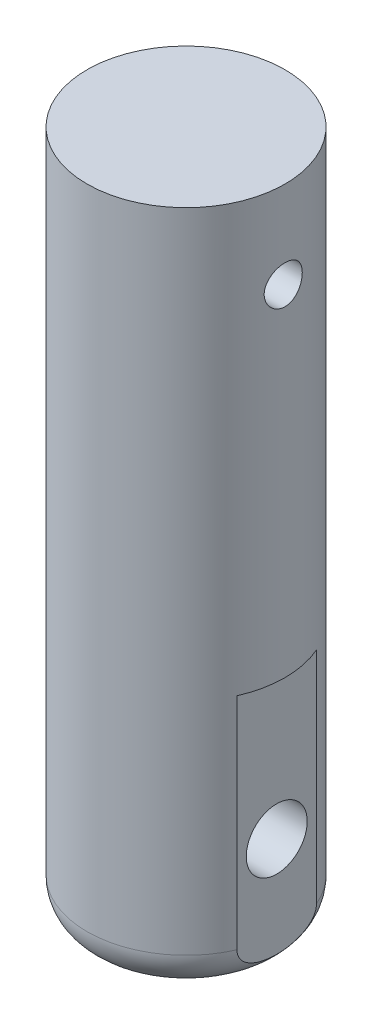
ISO-10303-21;
HEADER;
FILE_DESCRIPTION(('STEP AP214'),'2;1');
FILE_NAME('part.step','',(''),(''),'','','');
FILE_SCHEMA(('AUTOMOTIVE_DESIGN { 1 0 10303 214 1 1 1 1 }'));
ENDSEC;
DATA;
#1=APPLICATION_CONTEXT('core data for automotive mechanical design processes');
#2=APPLICATION_PROTOCOL_DEFINITION('international standard','automotive_design',2000,#1);
#3=PRODUCT_CONTEXT('',#1,'mechanical');
#4=PRODUCT('Part','Part','',(#3));
#5=PRODUCT_RELATED_PRODUCT_CATEGORY('part','',(#4));
#6=PRODUCT_DEFINITION_FORMATION('','',#4);
#7=PRODUCT_DEFINITION_CONTEXT('part definition',#1,'design');
#8=PRODUCT_DEFINITION('design','',#6,#7);
#9=PRODUCT_DEFINITION_SHAPE('','',#8);
#10=(LENGTH_UNIT() NAMED_UNIT(*) SI_UNIT(.MILLI.,.METRE.));
#11=(NAMED_UNIT(*) PLANE_ANGLE_UNIT() SI_UNIT($,.RADIAN.));
#12=(NAMED_UNIT(*) SI_UNIT($,.STERADIAN.) SOLID_ANGLE_UNIT());
#13=UNCERTAINTY_MEASURE_WITH_UNIT(LENGTH_MEASURE(1.E-05),#10,'distance_accuracy_value','');
#14=(GEOMETRIC_REPRESENTATION_CONTEXT(3) GLOBAL_UNCERTAINTY_ASSIGNED_CONTEXT((#13)) GLOBAL_UNIT_ASSIGNED_CONTEXT((#10,
#11,#12)) REPRESENTATION_CONTEXT('',''));
#15=CARTESIAN_POINT('',(0.,0.,0.));
#16=DIRECTION('',(0.,0.,1.));
#17=DIRECTION('',(1.,0.,0.));
#18=AXIS2_PLACEMENT_3D('',#15,#16,#17);
#19=CARTESIAN_POINT('',(0.959256221842165,90.,-2.8421709430404E-11));
#20=DIRECTION('',(0.,-1.,0.));
#21=DIRECTION('',(0.,0.,-1.));
#22=AXIS2_PLACEMENT_3D('',#19,#20,#21);
#23=CYLINDRICAL_SURFACE('',#22,13.);
#24=CARTESIAN_POINT('',(-11.7980944172989,78.559645060139,-2.5000009340297));
#25=CARTESIAN_POINT('',(-11.7980971397234,78.6986709186465,-2.49999567174065));
#26=CARTESIAN_POINT('',(-11.800391702647,78.8377642878141,-2.48836465883411));
#27=CARTESIAN_POINT('',(-11.8093098315006,79.112024114006,-2.44218207228531));
#28=CARTESIAN_POINT('',(-11.8159369909497,79.247187213923,-2.4076114718561));
#29=CARTESIAN_POINT('',(-11.8327426152477,79.5095786960919,-2.31665468417989));
#30=CARTESIAN_POINT('',(-11.8429176866454,79.6368145239185,-2.26028933723979));
#31=CARTESIAN_POINT('',(-11.8656686376155,79.8800175977177,-2.12739897712118));
#32=CARTESIAN_POINT('',(-11.8782443500382,79.9959856273865,-2.05087536736297));
#33=CARTESIAN_POINT('',(-11.9045634266255,80.2148862582884,-1.87877340478143));
#34=CARTESIAN_POINT('',(-11.9183187571341,80.3176499954425,-1.78298206659836));
#35=CARTESIAN_POINT('',(-11.9453416423316,80.5057525765596,-1.57552407348461));
#36=CARTESIAN_POINT('',(-11.9586091641418,80.5910902477511,-1.4638563509329));
#37=CARTESIAN_POINT('',(-11.9832900646934,80.7425684592079,-1.22670282510391));
#38=CARTESIAN_POINT('',(-11.9946876956765,80.808549309162,-1.10111324278706));
#39=CARTESIAN_POINT('',(-12.0142104859742,80.9184114786799,-0.840375431836772));
#40=CARTESIAN_POINT('',(-12.0223359283465,80.9622947098609,-0.705228031183496));
#41=CARTESIAN_POINT('',(-12.0343142975435,81.026192460814,-0.43096179585055));
#42=CARTESIAN_POINT('',(-12.0382181729573,81.0464918335644,-0.291911587409392));
#43=CARTESIAN_POINT('',(-12.0414892890508,81.0635336433959,-0.0123280169445277));
#44=CARTESIAN_POINT('',(-12.0408569352359,81.0602781861046,0.128205211386721));
#45=CARTESIAN_POINT('',(-12.0351665307891,81.0305202987771,0.404810638875102));
#46=CARTESIAN_POINT('',(-12.0301668824495,81.0043246285081,0.540917215509431));
#47=CARTESIAN_POINT('',(-12.0163692903157,80.9299156074697,0.806766110944418));
#48=CARTESIAN_POINT('',(-12.0075712028652,80.8817014239592,0.936508188833932));
#49=CARTESIAN_POINT('',(-11.987068189863,80.7643347796258,1.18682943011321));
#50=CARTESIAN_POINT('',(-11.9753464416461,80.6950606169463,1.30735009768936));
#51=CARTESIAN_POINT('',(-11.950290868334,80.5376302693267,1.53517053007103));
#52=CARTESIAN_POINT('',(-11.9369568711973,80.449472068515,1.64246888146599));
#53=CARTESIAN_POINT('',(-11.9098984475364,80.2550885563889,1.84261753033746));
#54=CARTESIAN_POINT('',(-11.8961711923935,80.1485948325347,1.93520695029387));
#55=CARTESIAN_POINT('',(-11.870078331895,79.921454894863,2.10125222332554));
#56=CARTESIAN_POINT('',(-11.8577127485699,79.8008084521354,2.17470776686218));
#57=CARTESIAN_POINT('',(-11.835738633768,79.548431056198,2.30048039273782));
#58=CARTESIAN_POINT('',(-11.826135268998,79.4166799190848,2.35275793541656));
#59=CARTESIAN_POINT('',(-11.8108507241306,79.1460375213901,2.43436016291581));
#60=CARTESIAN_POINT('',(-11.8051690746174,79.0071471174932,2.46368759484182));
#61=CARTESIAN_POINT('',(-11.7984645750477,78.7285257516579,2.49817281715572));
#62=CARTESIAN_POINT('',(-11.7973693475591,78.5888429614396,2.50370613571886));
#63=CARTESIAN_POINT('',(-11.7997677911244,78.3105497087784,2.49145416692711));
#64=CARTESIAN_POINT('',(-11.8032612227563,78.1719391907671,2.47367009620102));
#65=CARTESIAN_POINT('',(-11.8143758073665,77.9009701246894,2.41561107418377));
#66=CARTESIAN_POINT('',(-11.8219605505121,77.7685674616008,2.37553441471657));
#67=CARTESIAN_POINT('',(-11.8403715692082,77.5123562141378,2.27423885331137));
#68=CARTESIAN_POINT('',(-11.8511980943881,77.3885482924956,2.21301832316024));
#69=CARTESIAN_POINT('',(-11.8750367829121,77.1513908141813,2.07031392274542));
#70=CARTESIAN_POINT('',(-11.8880738231902,77.038186041133,1.98859367486248));
#71=CARTESIAN_POINT('',(-11.9147952725554,76.8269599349772,1.80752693793028));
#72=CARTESIAN_POINT('',(-11.9284797429249,76.7289400429628,1.70817877785359));
#73=CARTESIAN_POINT('',(-11.9551876154916,76.5494553012272,1.49299586921777));
#74=CARTESIAN_POINT('',(-11.9681989675136,76.4682435218552,1.37694830002523));
#75=CARTESIAN_POINT('',(-11.9918892910868,76.326469749151,1.13263845855683));
#76=CARTESIAN_POINT('',(-12.0025683556221,76.2659069325296,1.00437667353161));
#77=CARTESIAN_POINT('',(-12.0203391787576,76.1675253277563,0.739965671189725));
#78=CARTESIAN_POINT('',(-12.0274501923129,76.1295842477865,0.603863307150021));
#79=CARTESIAN_POINT('',(-12.0373660039254,76.0771338650421,0.327067836726058));
#80=CARTESIAN_POINT('',(-12.0401712797292,76.0626219626551,0.186375241423923));
#81=CARTESIAN_POINT('',(-12.0411493586046,76.0575362286909,-0.0931836858623237));
#82=CARTESIAN_POINT('',(-12.0393960014737,76.066580837747,-0.232042961197029));
#83=CARTESIAN_POINT('',(-12.0316079438595,76.1075131395538,-0.506223837288953));
#84=CARTESIAN_POINT('',(-12.0255732891007,76.1394005883414,-0.641545475812393));
#85=CARTESIAN_POINT('',(-12.0099014609157,76.2249492500241,-0.904594476849406));
#86=CARTESIAN_POINT('',(-12.0002713381887,76.2785678656703,-1.03233613917707));
#87=CARTESIAN_POINT('',(-11.9784489398509,76.406010171169,-1.27706581062707));
#88=CARTESIAN_POINT('',(-11.9662564807801,76.479835307897,-1.39405304888382));
#89=CARTESIAN_POINT('',(-11.9404221422343,76.6468985066637,-1.61584888729335));
#90=CARTESIAN_POINT('',(-11.9267612599061,76.7404112289077,-1.72044841551952));
#91=CARTESIAN_POINT('',(-11.8996469671174,76.9436272407623,-1.91260259859767));
#92=CARTESIAN_POINT('',(-11.8861936063231,77.0533343417562,-2.00015322967344));
#93=CARTESIAN_POINT('',(-11.8608728469407,77.2871148997878,-2.15653545871387));
#94=CARTESIAN_POINT('',(-11.849022314609,77.4113188205869,-2.225174850856));
#95=CARTESIAN_POINT('',(-11.8284530221613,77.6696858374121,-2.34050247970484));
#96=CARTESIAN_POINT('',(-11.8197313509491,77.8038395351514,-2.3872111333595));
#97=CARTESIAN_POINT('',(-11.8081966950483,78.0419034398251,-2.44802229724361));
#98=CARTESIAN_POINT('',(-11.8044312058966,78.144433051697,-2.46748032944631));
#99=CARTESIAN_POINT('',(-11.7993790832428,78.3511775084541,-2.49347142813256));
#100=CARTESIAN_POINT('',(-11.7980923758063,78.455392302982,-2.50000488011677));
#101=CARTESIAN_POINT('',(-11.7980944172989,78.559645060139,-2.5000009340297));
#102=B_SPLINE_CURVE_WITH_KNOTS('',3,(#24,#25,#26,#27,#28,#29,#30,#31,#32,#33,#34,#35,#36,#37,
#38,#39,#40,#41,#42,#43,#44,#45,#46,#47,#48,#49,#50,#51,#52,#53,#54,#55,#56,#57,#58,#59,#60,#61,
#62,#63,#64,#65,#66,#67,#68,#69,#70,#71,#72,#73,#74,#75,#76,#77,#78,#79,#80,#81,#82,#83,#84,#85,
#86,#87,#88,#89,#90,#91,#92,#93,#94,#95,#96,#97,#98,#99,#100,#101),.UNSPECIFIED.,.T.,.F.,(4,2,2,
2,2,2,2,2,2,2,2,2,2,2,2,2,2,2,2,2,2,2,2,2,2,2,2,2,2,2,2,2,2,2,2,2,2,2,4),(0.,0.416695985118148,
0.833738023215457,1.25038226469638,1.66699750702541,2.08849970236398,2.51003025539547,
2.93494640993358,3.35982579957455,3.77951818897218,4.19917306143563,4.61330049504123,
5.02744359226087,5.44402696931091,5.86065483883219,6.28400091191223,6.7073538332553,
7.13149355823785,7.55558250634716,7.97295316527277,8.39030204796307,8.80399665654658,
9.21772312936364,9.63645909596412,10.0552347776182,10.4799185977028,10.9045854833524,
11.3269353243872,11.7492382998709,12.1647436718214,12.5802446062103,12.9949349882404,
13.4096550716935,13.8305978127769,14.2516397820953,14.6768151928321,15.1015939875861,
15.4140754324223,15.7265475567534),.UNSPECIFIED.);
#103=CARTESIAN_POINT('',(-11.7980944172989,78.559645060139,-2.5000009340297));
#104=VERTEX_POINT('',#103);
#105=EDGE_CURVE('E37',#104,#104,#102,.T.);
#106=ORIENTED_EDGE('',*,*,#105,.T.);
#107=EDGE_LOOP('',(#106));
#108=FACE_BOUND('',#107,.T.);
#109=CARTESIAN_POINT('',(13.7166068609832,78.559645060139,-2.5000009340297));
#110=CARTESIAN_POINT('',(13.7166095834078,78.4206192016314,-2.49999567174065));
#111=CARTESIAN_POINT('',(13.7189041463314,78.2815258324638,-2.48836465883411));
#112=CARTESIAN_POINT('',(13.727822275185,78.0072660062719,-2.44218207228531));
#113=CARTESIAN_POINT('',(13.734449434634,77.8721029063549,-2.4076114718561));
#114=CARTESIAN_POINT('',(13.7512550589321,77.609711424186,-2.31665468417989));
#115=CARTESIAN_POINT('',(13.7614301303298,77.4824755963594,-2.26028933723979));
#116=CARTESIAN_POINT('',(13.7841810812998,77.2392725225602,-2.12739897712118));
#117=CARTESIAN_POINT('',(13.7967567937225,77.1233044928915,-2.05087536736297));
#118=CARTESIAN_POINT('',(13.8230758703099,76.9044038619895,-1.87877340478143));
#119=CARTESIAN_POINT('',(13.8368312008184,76.8016401248355,-1.78298206659836));
#120=CARTESIAN_POINT('',(13.8638540860159,76.6135375437183,-1.57552407348461));
#121=CARTESIAN_POINT('',(13.8771216078261,76.5281998725268,-1.4638563509329));
#122=CARTESIAN_POINT('',(13.9018025083777,76.37672166107,-1.22670282510391));
#123=CARTESIAN_POINT('',(13.9132001393609,76.3107408111159,-1.10111324278706));
#124=CARTESIAN_POINT('',(13.9327229296585,76.200878641598,-0.84037543183677));
#125=CARTESIAN_POINT('',(13.9408483720308,76.1569954104171,-0.705228031183493));
#126=CARTESIAN_POINT('',(13.9528267412279,76.0930976594639,-0.430961795850548));
#127=CARTESIAN_POINT('',(13.9567306166417,76.0727982867135,-0.291911587409391));
#128=CARTESIAN_POINT('',(13.9600017327351,76.0557564768821,-0.0123280169445272));
#129=CARTESIAN_POINT('',(13.9593693789203,76.0590119341733,0.128205211386722));
#130=CARTESIAN_POINT('',(13.9536789744735,76.0887698215008,0.404810638875103));
#131=CARTESIAN_POINT('',(13.9486793261338,76.1149654917698,0.540917215509432));
#132=CARTESIAN_POINT('',(13.934881734,76.1893745128082,0.806766110944422));
#133=CARTESIAN_POINT('',(13.9260836465495,76.2375886963187,0.936508188833937));
#134=CARTESIAN_POINT('',(13.9055806335473,76.3549553406521,1.18682943011321));
#135=CARTESIAN_POINT('',(13.8938588853304,76.4242295033316,1.30735009768936));
#136=CARTESIAN_POINT('',(13.8688033120183,76.5816598509512,1.53517053007103));
#137=CARTESIAN_POINT('',(13.8554693148816,76.669818051763,1.642468881466));
#138=CARTESIAN_POINT('',(13.8284108912208,76.864201563889,1.84261753033746));
#139=CARTESIAN_POINT('',(13.8146836360778,76.9706952877432,1.93520695029388));
#140=CARTESIAN_POINT('',(13.7885907755794,77.197835225415,2.10125222332554));
#141=CARTESIAN_POINT('',(13.7762251922542,77.3184816681426,2.17470776686218));
#142=CARTESIAN_POINT('',(13.7542510774524,77.5708590640799,2.30048039273782));
#143=CARTESIAN_POINT('',(13.7446477126824,77.7026102011931,2.35275793541655));
#144=CARTESIAN_POINT('',(13.7293631678149,77.9732525988878,2.43436016291581));
#145=CARTESIAN_POINT('',(13.7236815183017,78.1121430027847,2.46368759484182));
#146=CARTESIAN_POINT('',(13.716977018732,78.39076436862,2.49817281715572));
#147=CARTESIAN_POINT('',(13.7158817912434,78.5304471588383,2.50370613571886));
#148=CARTESIAN_POINT('',(13.7182802348087,78.8087404114995,2.49145416692711));
#149=CARTESIAN_POINT('',(13.7217736664407,78.9473509295108,2.47367009620102));
#150=CARTESIAN_POINT('',(13.7328882510508,79.2183199955885,2.41561107418377));
#151=CARTESIAN_POINT('',(13.7404729941964,79.3507226586772,2.37553441471657));
#152=CARTESIAN_POINT('',(13.7588840128925,79.6069339061401,2.27423885331137));
#153=CARTESIAN_POINT('',(13.7697105380724,79.7307418277823,2.21301832316024));
#154=CARTESIAN_POINT('',(13.7935492265964,79.9678993060967,2.07031392274542));
#155=CARTESIAN_POINT('',(13.8065862668745,80.0811040791449,1.98859367486248));
#156=CARTESIAN_POINT('',(13.8333077162397,80.2923301853007,1.80752693793028));
#157=CARTESIAN_POINT('',(13.8469921866092,80.3903500773151,1.70817877785358));
#158=CARTESIAN_POINT('',(13.873700059176,80.5698348190507,1.49299586921777));
#159=CARTESIAN_POINT('',(13.8867114111979,80.6510465984227,1.37694830002522));
#160=CARTESIAN_POINT('',(13.9104017347711,80.7928203711269,1.13263845855683));
#161=CARTESIAN_POINT('',(13.9210807993064,80.8533831877484,1.00437667353161));
#162=CARTESIAN_POINT('',(13.938851622442,80.9517647925217,0.739965671189723));
#163=CARTESIAN_POINT('',(13.9459626359972,80.9897058724914,0.603863307150019));
#164=CARTESIAN_POINT('',(13.9558784476097,81.0421562552358,0.327067836726056));
#165=CARTESIAN_POINT('',(13.9586837234135,81.0566681576229,0.186375241423921));
#166=CARTESIAN_POINT('',(13.9596618022889,81.061753891587,-0.0931836858623257));
#167=CARTESIAN_POINT('',(13.9579084451581,81.0527092825309,-0.232042961197031));
#168=CARTESIAN_POINT('',(13.9501203875438,81.0117769807241,-0.506223837288955));
#169=CARTESIAN_POINT('',(13.944085732785,80.9798895319365,-0.641545475812395));
#170=CARTESIAN_POINT('',(13.9284139046001,80.8943408702539,-0.90459447684941));
#171=CARTESIAN_POINT('',(13.918783781873,80.8407222546076,-1.03233613917707));
#172=CARTESIAN_POINT('',(13.8969613835352,80.713279949109,-1.27706581062708));
#173=CARTESIAN_POINT('',(13.8847689244645,80.6394548123809,-1.39405304888383));
#174=CARTESIAN_POINT('',(13.8589345859186,80.4723916136142,-1.61584888729335));
#175=CARTESIAN_POINT('',(13.8452737035904,80.3788788913702,-1.72044841551952));
#176=CARTESIAN_POINT('',(13.8181594108017,80.1756628795156,-1.91260259859767));
#177=CARTESIAN_POINT('',(13.8047060500075,80.0659557785218,-2.00015322967344));
#178=CARTESIAN_POINT('',(13.779385290625,79.8321752204901,-2.15653545871387));
#179=CARTESIAN_POINT('',(13.7675347582933,79.707971299691,-2.225174850856));
#180=CARTESIAN_POINT('',(13.7469654658456,79.4496042828658,-2.34050247970484));
#181=CARTESIAN_POINT('',(13.7382437946334,79.3154505851265,-2.3872111333595));
#182=CARTESIAN_POINT('',(13.7267091387326,79.0773866804528,-2.44802229724361));
#183=CARTESIAN_POINT('',(13.7229436495809,78.9748570685809,-2.46748032944631));
#184=CARTESIAN_POINT('',(13.7178915269271,78.7681126118238,-2.49347142813256));
#185=CARTESIAN_POINT('',(13.7166048194906,78.6638978172959,-2.50000488011677));
#186=CARTESIAN_POINT('',(13.7166068609832,78.559645060139,-2.5000009340297));
#187=B_SPLINE_CURVE_WITH_KNOTS('',3,(#109,#110,#111,#112,#113,#114,#115,#116,#117,#118,#119,
#120,#121,#122,#123,#124,#125,#126,#127,#128,#129,#130,#131,#132,#133,#134,#135,#136,#137,#138,
#139,#140,#141,#142,#143,#144,#145,#146,#147,#148,#149,#150,#151,#152,#153,#154,#155,#156,#157,
#158,#159,#160,#161,#162,#163,#164,#165,#166,#167,#168,#169,#170,#171,#172,#173,#174,#175,#176,
#177,#178,#179,#180,#181,#182,#183,#184,#185,#186),.UNSPECIFIED.,.T.,.F.,(4,2,2,2,2,2,2,2,2,2,2,
2,2,2,2,2,2,2,2,2,2,2,2,2,2,2,2,2,2,2,2,2,2,2,2,2,2,2,4),(0.,0.416695985118148,
0.833738023215457,1.25038226469638,1.66699750702541,2.08849970236398,2.51003025539547,
2.93494640993359,3.35982579957455,3.77951818897218,4.19917306143563,4.61330049504124,
5.02744359226087,5.44402696931092,5.86065483883219,6.28400091191223,6.7073538332553,
7.13149355823782,7.55558250634716,7.97295316527277,8.39030204796307,8.80399665654658,
9.21772312936364,9.63645909596412,10.0552347776182,10.4799185977028,10.9045854833524,
11.3269353243872,11.7492382998709,12.1647436718214,12.5802446062103,12.9949349882404,
13.4096550716935,13.8305978127769,14.2516397820953,14.6768151928321,15.1015939875861,
15.4140754324223,15.7265475567534),.UNSPECIFIED.);
#188=CARTESIAN_POINT('',(13.7166068609832,78.559645060139,-2.5000009340297));
#189=VERTEX_POINT('',#188);
#190=EDGE_CURVE('E133',#189,#189,#187,.T.);
#191=ORIENTED_EDGE('',*,*,#190,.T.);
#192=EDGE_LOOP('',(#191));
#193=FACE_BOUND('',#192,.T.);
#194=CARTESIAN_POINT('',(0.959256221842165,33.8820626301997,-2.8421709430404E-11));
#195=DIRECTION('',(0.,1.,0.));
#196=DIRECTION('',(0.,0.,1.));
#197=AXIS2_PLACEMENT_3D('',#194,#195,#196);
#198=CIRCLE('',#197,13.);
#199=CARTESIAN_POINT('',(12.8651467831635,33.8820626301997,5.2201312188051));
#200=VERTEX_POINT('',#199);
#201=CARTESIAN_POINT('',(12.8651467831635,33.8820626301997,-5.22013121886194));
#202=VERTEX_POINT('',#201);
#203=EDGE_CURVE('E11',#200,#202,#198,.T.);
#204=ORIENTED_EDGE('',*,*,#203,.T.);
#205=DIRECTION('',(0.,-1.,0.));
#206=VECTOR('',#205,1.);
#207=CARTESIAN_POINT('',(12.8651467831635,90.,-5.22013121886194));
#208=LINE('',#207,#206);
#209=CARTESIAN_POINT('',(12.8651467831635,4.99999999999999,-5.22013121886193));
#210=VERTEX_POINT('',#209);
#211=EDGE_CURVE('E79',#202,#210,#208,.T.);
#212=ORIENTED_EDGE('',*,*,#211,.T.);
#213=CARTESIAN_POINT('',(0.959256221842165,4.99999999999999,-2.8421709430404E-11));
#214=DIRECTION('',(0.,1.,0.));
#215=DIRECTION('',(0.,0.,1.));
#216=AXIS2_PLACEMENT_3D('',#213,#214,#215);
#217=CIRCLE('',#216,13.);
#218=CARTESIAN_POINT('',(-10.7573559004421,4.99999999999999,-5.63213994643798));
#219=VERTEX_POINT('',#218);
#220=EDGE_CURVE('E61',#210,#219,#217,.T.);
#221=ORIENTED_EDGE('',*,*,#220,.T.);
#222=DIRECTION('',(0.,-1.,0.));
#223=VECTOR('',#222,1.);
#224=CARTESIAN_POINT('',(-10.7573559004421,90.,-5.63213994643799));
#225=LINE('',#224,#223);
#226=CARTESIAN_POINT('',(-10.7573559004421,33.8820626301997,-5.632139946438));
#227=VERTEX_POINT('',#226);
#228=EDGE_CURVE('E109',#219,#227,#225,.F.);
#229=ORIENTED_EDGE('',*,*,#228,.T.);
#230=CARTESIAN_POINT('',(0.959256221842165,33.8820626301997,-2.8421709430404E-11));
#231=DIRECTION('',(0.,1.,0.));
#232=DIRECTION('',(0.,0.,1.));
#233=AXIS2_PLACEMENT_3D('',#230,#231,#232);
#234=CIRCLE('',#233,13.);
#235=CARTESIAN_POINT('',(-10.7573559004421,33.8820626301997,5.63213994638114));
#236=VERTEX_POINT('',#235);
#237=EDGE_CURVE('E45',#227,#236,#234,.T.);
#238=ORIENTED_EDGE('',*,*,#237,.T.);
#239=DIRECTION('',(0.,-1.,0.));
#240=VECTOR('',#239,1.);
#241=CARTESIAN_POINT('',(-10.7573559004421,90.,5.63213994638115));
#242=LINE('',#241,#240);
#243=CARTESIAN_POINT('',(-10.7573559004421,4.99999999999999,5.63213994638114));
#244=VERTEX_POINT('',#243);
#245=EDGE_CURVE('E163',#236,#244,#242,.T.);
#246=ORIENTED_EDGE('',*,*,#245,.T.);
#247=CARTESIAN_POINT('',(12.8651467831635,4.99999999999999,5.22013121880509));
#248=VERTEX_POINT('',#247);
#249=EDGE_CURVE('E94',#244,#248,#217,.T.);
#250=ORIENTED_EDGE('',*,*,#249,.T.);
#251=DIRECTION('',(0.,-1.,0.));
#252=VECTOR('',#251,1.);
#253=CARTESIAN_POINT('',(12.8651467831635,90.,5.2201312188051));
#254=LINE('',#253,#252);
#255=EDGE_CURVE('E53',#248,#200,#254,.F.);
#256=ORIENTED_EDGE('',*,*,#255,.T.);
#257=EDGE_LOOP('',(#204,#212,#221,#229,#238,#246,#250,#256));
#258=FACE_BOUND('',#257,.T.);
#259=CARTESIAN_POINT('',(0.959256221842165,90.,-2.8421709430404E-11));
#260=DIRECTION('',(0.,1.,0.));
#261=DIRECTION('',(0.,0.,1.));
#262=AXIS2_PLACEMENT_3D('',#259,#260,#261);
#263=CIRCLE('',#262,13.);
#264=CARTESIAN_POINT('',(0.959256221842165,90.,12.9999999999716));
#265=VERTEX_POINT('',#264);
#266=EDGE_CURVE('E161',#265,#265,#263,.T.);
#267=ORIENTED_EDGE('',*,*,#266,.F.);
#268=EDGE_LOOP('',(#267));
#269=FACE_BOUND('',#268,.T.);
#270=ADVANCED_FACE('F32',(#108,#193,#258,#269),#23,.T.);
#271=CARTESIAN_POINT('',(0.959256221842165,90.,-2.8421709430404E-11));
#272=DIRECTION('',(0.,1.,0.));
#273=DIRECTION('',(0.,0.,1.));
#274=AXIS2_PLACEMENT_3D('',#271,#272,#273);
#275=PLANE('',#274);
#276=ORIENTED_EDGE('',*,*,#266,.T.);
#277=EDGE_LOOP('',(#276));
#278=FACE_BOUND('',#277,.T.);
#279=ADVANCED_FACE('F122',(#278),#275,.T.);
#280=CARTESIAN_POINT('',(0.959256221842165,0.,-2.8421709430404E-11));
#281=DIRECTION('',(0.,1.,0.));
#282=DIRECTION('',(0.,0.,1.));
#283=AXIS2_PLACEMENT_3D('',#280,#281,#282);
#284=PLANE('',#283);
#285=CARTESIAN_POINT('',(0.959256221842165,0.,-2.8421709430404E-11));
#286=DIRECTION('',(0.,1.,0.));
#287=DIRECTION('',(0.,0.,1.));
#288=AXIS2_PLACEMENT_3D('',#285,#286,#287);
#289=CIRCLE('',#288,8.);
#290=CARTESIAN_POINT('',(0.959256221842165,0.,7.99999999997158));
#291=VERTEX_POINT('',#290);
#292=EDGE_CURVE('E155',#291,#291,#289,.F.);
#293=ORIENTED_EDGE('',*,*,#292,.T.);
#294=EDGE_LOOP('',(#293));
#295=FACE_BOUND('',#294,.T.);
#296=ADVANCED_FACE('F125',(#295),#284,.F.);
#297=CARTESIAN_POINT('',(0.959256221842165,5.,-2.8421709430404E-11));
#298=DIRECTION('',(0.,1.,0.));
#299=DIRECTION('',(0.,0.,1.));
#300=AXIS2_PLACEMENT_3D('',#297,#298,#299);
#301=TOROIDAL_SURFACE('',#300,8.,5.);
#302=CARTESIAN_POINT('',(12.8651467831635,1.8784588865464,-2.8421709430404E-11));
#303=CARTESIAN_POINT('',(12.8651467831635,1.87846126844624,-0.211237772387843));
#304=CARTESIAN_POINT('',(12.8651467831635,1.88546984182745,-0.422466291062263));
#305=CARTESIAN_POINT('',(12.8651467831635,1.91379882814743,-0.84406253204711));
#306=CARTESIAN_POINT('',(12.8651467831635,1.93512477482787,-1.0544298898724));
#307=CARTESIAN_POINT('',(12.8651467831635,1.99293578740129,-1.47298017523303));
#308=CARTESIAN_POINT('',(12.8651467831635,2.02941211735921,-1.68116429084814));
#309=CARTESIAN_POINT('',(12.8651467831635,2.11896200644368,-2.09384192548815));
#310=CARTESIAN_POINT('',(12.8651467831635,2.17202475130698,-2.29833775763182));
#311=CARTESIAN_POINT('',(12.8651467831635,2.30279432890838,-2.72085137652695));
#312=CARTESIAN_POINT('',(12.8651467831635,2.38236571194513,-2.93830424727448));
#313=CARTESIAN_POINT('',(12.8651467831635,2.56758708692216,-3.36196630771447));
#314=CARTESIAN_POINT('',(12.8651467831635,2.6732195546939,-3.56818293965914));
#315=CARTESIAN_POINT('',(12.8651467831635,2.89505705404098,-3.92987527904553));
#316=CARTESIAN_POINT('',(12.8651467831635,3.00668333506172,-4.08812468964284));
#317=CARTESIAN_POINT('',(12.8651467831635,3.25361822189501,-4.3850572811774));
#318=CARTESIAN_POINT('',(12.8651467831635,3.38887942901239,-4.52377863785878));
#319=CARTESIAN_POINT('',(12.8651467831635,3.6398840767057,-4.73506619921304));
#320=CARTESIAN_POINT('',(12.8651467831635,3.74938544719257,-4.81501495879664));
#321=CARTESIAN_POINT('',(12.8651467831635,3.97980397304361,-4.95651382681018));
#322=CARTESIAN_POINT('',(12.8651467831635,4.10071405760549,-5.01807523392174));
#323=CARTESIAN_POINT('',(12.8651467831635,4.3529947671022,-5.11895068799016));
#324=CARTESIAN_POINT('',(12.8651467831635,4.48445445998809,-5.15804609149867));
#325=CARTESIAN_POINT('',(12.8651467831635,4.75251663889433,-5.20940133456385));
#326=CARTESIAN_POINT('',(12.8651467831635,4.88911395573751,-5.22168745022129));
#327=CARTESIAN_POINT('',(12.8651467831635,5.1427630319286,-5.21849202286174));
#328=CARTESIAN_POINT('',(12.8651467831635,5.25987566610552,-5.20665479549435));
#329=CARTESIAN_POINT('',(12.8651467831635,5.49034971066087,-5.16322611174264));
#330=CARTESIAN_POINT('',(12.8651467831635,5.60371077979859,-5.13163286353102));
#331=CARTESIAN_POINT('',(12.8651467831635,5.82283398744835,-5.05125807657883));
#332=CARTESIAN_POINT('',(12.8651467831635,5.92865857843999,-5.00264429334229));
#333=CARTESIAN_POINT('',(12.8651467831635,6.13226319848441,-4.89089438239604));
#334=CARTESIAN_POINT('',(12.8651467831635,6.2300400341998,-4.82775252732776));
#335=CARTESIAN_POINT('',(12.8651467831635,6.46709938366532,-4.65243072881046));
#336=CARTESIAN_POINT('',(12.8651467831635,6.60039883302482,-4.53214794652401));
#337=CARTESIAN_POINT('',(12.8651467831635,6.84622437964161,-4.2719661527214));
#338=CARTESIAN_POINT('',(12.8651467831635,6.95869571189141,-4.13201708201226));
#339=CARTESIAN_POINT('',(12.8651467831635,7.21967566149214,-3.75994908467156));
#340=CARTESIAN_POINT('',(12.8651467831635,7.35512698047059,-3.51867551354773));
#341=CARTESIAN_POINT('',(12.8651467831635,7.52958431706759,-3.14401630234399));
#342=CARTESIAN_POINT('',(12.8651467831635,7.58300147816356,-3.01682919834571));
#343=CARTESIAN_POINT('',(12.8651467831635,7.68111685298579,-2.75912521253315));
#344=CARTESIAN_POINT('',(12.8651467831635,7.72581704582598,-2.62860909417075));
#345=CARTESIAN_POINT('',(12.8651467831635,7.83343556678056,-2.28035970682923));
#346=CARTESIAN_POINT('',(12.8651467831635,7.88957475757856,-2.06053251669518));
#347=CARTESIAN_POINT('',(12.8651467831635,7.98291114302381,-1.61684574069814));
#348=CARTESIAN_POINT('',(12.8651467831635,8.02009564623151,-1.39298355670467));
#349=CARTESIAN_POINT('',(12.8651467831635,8.07729394132129,-0.942322808200939));
#350=CARTESIAN_POINT('',(12.8651467831635,8.09724832026427,-0.715516799201939));
#351=CARTESIAN_POINT('',(12.8651467831635,8.12070011643106,-0.261135736980476));
#352=CARTESIAN_POINT('',(12.8651467831635,8.12420190754456,-0.0335609042499362));
#353=CARTESIAN_POINT('',(12.8651467831635,8.11467959012087,0.433505531267465));
#354=CARTESIAN_POINT('',(12.8651467831635,8.1007563922714,0.672979658546124));
#355=CARTESIAN_POINT('',(12.8651467831635,8.05410186662459,1.15024414235633));
#356=CARTESIAN_POINT('',(12.8651467831635,8.02136121979854,1.38803360547514));
#357=CARTESIAN_POINT('',(12.8651467831635,7.93560046492698,1.85863288618775));
#358=CARTESIAN_POINT('',(12.8651467831635,7.88269355788002,2.09146297558947));
#359=CARTESIAN_POINT('',(12.8651467831635,7.75396009059026,2.55054661362269));
#360=CARTESIAN_POINT('',(12.8651467831635,7.67816333638949,2.7768082978334));
#361=CARTESIAN_POINT('',(12.8651467831635,7.51452773230985,3.18243497222628));
#362=CARTESIAN_POINT('',(12.8651467831635,7.43070655458715,3.36340242003337));
#363=CARTESIAN_POINT('',(12.8651467831635,7.24155695358594,3.71424614622504));
#364=CARTESIAN_POINT('',(12.8651467831635,7.13620358143382,3.88410925416605));
#365=CARTESIAN_POINT('',(12.8651467831635,6.8996498533099,4.20862964700099));
#366=CARTESIAN_POINT('',(12.8651467831635,6.76812437985023,4.3630546571539));
#367=CARTESIAN_POINT('',(12.8651467831635,6.47815969543227,4.64416729499835));
#368=CARTESIAN_POINT('',(12.8651467831635,6.3198233133523,4.77095681655789));
#369=CARTESIAN_POINT('',(12.8651467831635,6.04367540193608,4.94295813767014));
#370=CARTESIAN_POINT('',(12.8651467831635,5.93370841683397,5.00078847136059));
#371=CARTESIAN_POINT('',(12.8651467831635,5.70577634343997,5.09778661349122));
#372=CARTESIAN_POINT('',(12.8651467831635,5.5878175085302,5.13696882519535));
#373=CARTESIAN_POINT('',(12.8651467831635,5.34602424145678,5.19398797573863));
#374=CARTESIAN_POINT('',(12.8651467831635,5.22215892527865,5.21169603378684));
#375=CARTESIAN_POINT('',(12.8651467831635,4.97329214952239,5.2238083156406));
#376=CARTESIAN_POINT('',(12.8651467831635,4.84829097135407,5.21821816253128));
#377=CARTESIAN_POINT('',(12.8651467831635,4.61205542968628,5.18571530451598));
#378=CARTESIAN_POINT('',(12.8651467831635,4.50055697212816,5.16066413420057));
#379=CARTESIAN_POINT('',(12.8651467831635,4.28296578034006,5.09324882801622));
#380=CARTESIAN_POINT('',(12.8651467831635,4.17687500346826,5.05087847266463));
#381=CARTESIAN_POINT('',(12.8651467831635,3.94071439454588,4.93600097752287));
#382=CARTESIAN_POINT('',(12.8651467831635,3.8132024796338,4.85824336454946));
#383=CARTESIAN_POINT('',(12.8651467831635,3.57254703841541,4.68305551344454));
#384=CARTESIAN_POINT('',(12.8651467831635,3.45942867163886,4.5855915784465));
#385=CARTESIAN_POINT('',(12.8651467831635,3.2025014467372,4.33122396231003));
#386=CARTESIAN_POINT('',(12.8651467831635,3.06625578539089,4.16672565905545));
#387=CARTESIAN_POINT('',(12.8651467831635,2.82090455918793,3.81863324386621));
#388=CARTESIAN_POINT('',(12.8651467831635,2.71186301743514,3.63499550071683));
#389=CARTESIAN_POINT('',(12.8651467831635,2.53624867604059,3.29205218298615));
#390=CARTESIAN_POINT('',(12.8651467831635,2.46554202548605,3.13481412648443));
#391=CARTESIAN_POINT('',(12.8651467831635,2.33797256913174,2.81474540196275));
#392=CARTESIAN_POINT('',(12.8651467831635,2.28111907439414,2.65191105595366));
#393=CARTESIAN_POINT('',(12.8651467831635,2.17983027853193,2.32237727975977));
#394=CARTESIAN_POINT('',(12.8651467831635,2.13540152382001,2.15567586197409));
#395=CARTESIAN_POINT('',(12.8651467831635,2.05784654589476,1.81975045553743));
#396=CARTESIAN_POINT('',(12.8651467831635,2.02471703966172,1.65052721454727));
#397=CARTESIAN_POINT('',(12.8651467831635,1.95661012549631,1.23592958310176));
#398=CARTESIAN_POINT('',(12.8651467831635,1.92716896739791,0.989638759240861));
#399=CARTESIAN_POINT('',(12.8651467831635,1.88809271480264,0.495560968455356));
#400=CARTESIAN_POINT('',(12.8651467831635,1.87845609266572,0.247774118406904));
#401=CARTESIAN_POINT('',(12.8651467831635,1.8784588865464,-2.8421709430404E-11));
#402=B_SPLINE_CURVE_WITH_KNOTS('',3,(#302,#303,#304,#305,#306,#307,#308,#309,#310,#311,#312,
#313,#314,#315,#316,#317,#318,#319,#320,#321,#322,#323,#324,#325,#326,#327,#328,#329,#330,#331,
#332,#333,#334,#335,#336,#337,#338,#339,#340,#341,#342,#343,#344,#345,#346,#347,#348,#349,#350,
#351,#352,#353,#354,#355,#356,#357,#358,#359,#360,#361,#362,#363,#364,#365,#366,#367,#368,#369,
#370,#371,#372,#373,#374,#375,#376,#377,#378,#379,#380,#381,#382,#383,#384,#385,#386,#387,#388,
#389,#390,#391,#392,#393,#394,#395,#396,#397,#398,#399,#400,#401),.UNSPECIFIED.,.T.,.F.,(4,2,2,
2,2,2,2,2,2,2,2,2,2,2,2,2,2,2,2,2,2,2,2,2,2,2,2,2,2,2,2,2,2,2,2,2,2,2,2,2,2,2,2,2,2,2,2,2,2,4),
(0.,0.633577529197486,1.26740008060031,1.9008576668056,2.53390310015,3.22718585689562,
3.92000369637617,4.49914182591511,5.07713157979693,5.48244002357019,5.88749889812465,
6.29643588264515,6.7049718828148,7.05635228306159,7.40776455735506,7.75580650697767,
8.10398589994888,8.63955247275074,9.17650785567664,10.001656650949,10.4153217525201,
10.8288928253013,11.5085180040598,12.1885976418689,12.8710130721416,13.5532470732791,
14.2721796204653,14.9914685142039,15.7067778468186,16.4211597256678,17.0183028721797,
17.6161418780949,18.2219318460326,18.8254489554768,19.196781109115,19.5678259893352,
19.9410869094112,20.3142577471906,20.6555628309682,20.9969905884493,21.4425742129054,
21.8889263075831,22.5261634897994,23.1648865132979,23.6813952362476,24.1982501662637,
24.7153769086582,25.2323532705663,25.9755736827977,26.7187367639262),.UNSPECIFIED.);
#403=EDGE_CURVE('E83',#248,#210,#402,.T.);
#404=ORIENTED_EDGE('',*,*,#403,.F.);
#405=ORIENTED_EDGE('',*,*,#249,.F.);
#406=CARTESIAN_POINT('',(-10.7573559004421,1.65533344973072,-2.8421709430404E-11));
#407=CARTESIAN_POINT('',(-10.7573559004421,1.65532769927825,0.265934593164106));
#408=CARTESIAN_POINT('',(-10.7573559004421,1.66534262043549,0.531903915099449));
#409=CARTESIAN_POINT('',(-10.7573559004421,1.70601941990338,1.06244874287584));
#410=CARTESIAN_POINT('',(-10.7573559004421,1.73669442600701,1.3270232546345));
#411=CARTESIAN_POINT('',(-10.7573559004421,1.8204267008436,1.85163861014123));
#412=CARTESIAN_POINT('',(-10.7573559004421,1.87339748782244,2.11169297088058));
#413=CARTESIAN_POINT('',(-10.7573559004421,2.00479802275721,2.62510976610391));
#414=CARTESIAN_POINT('',(-10.7573559004421,2.08319290996246,2.87848085299753));
#415=CARTESIAN_POINT('',(-10.7573559004421,2.25278005093301,3.32854644822315));
#416=CARTESIAN_POINT('',(-10.7573559004421,2.3389758992621,3.52710222718861));
#417=CARTESIAN_POINT('',(-10.7573559004421,2.53451431008668,3.91292261617482));
#418=CARTESIAN_POINT('',(-10.7573559004421,2.64387487335327,4.1001782988997));
#419=CARTESIAN_POINT('',(-10.7573559004421,2.89053132756012,4.45924748466853));
#420=CARTESIAN_POINT('',(-10.7573559004421,3.02816948604067,4.6308305412387));
#421=CARTESIAN_POINT('',(-10.7573559004421,3.33298912604442,4.94544168888962));
#422=CARTESIAN_POINT('',(-10.7573559004421,3.50006678036451,5.08856648973173));
#423=CARTESIAN_POINT('',(-10.7573559004421,3.79384057634613,5.28625216840215));
#424=CARTESIAN_POINT('',(-10.7573559004421,3.91180060072134,5.3538105717794));
#425=CARTESIAN_POINT('',(-10.7573559004421,4.1571635228521,5.46895165862767));
#426=CARTESIAN_POINT('',(-10.7573559004421,4.28455919514766,5.51654944484965));
#427=CARTESIAN_POINT('',(-10.7573559004421,4.54673300958182,5.58863882567554));
#428=CARTESIAN_POINT('',(-10.7573559004421,4.68155425938334,5.6129761260939));
#429=CARTESIAN_POINT('',(-10.7573559004421,4.95337680766745,5.63590891213028));
#430=CARTESIAN_POINT('',(-10.7573559004421,5.09037734201571,5.63451323016904));
#431=CARTESIAN_POINT('',(-10.7573559004421,5.3487252353442,5.60750432461232));
#432=CARTESIAN_POINT('',(-10.7573559004421,5.47032392484199,5.58420268997911));
#433=CARTESIAN_POINT('',(-10.7573559004421,5.70812590528459,5.51829696859787));
#434=CARTESIAN_POINT('',(-10.7573559004421,5.82432833204522,5.47568980183876));
#435=CARTESIAN_POINT('',(-10.7573559004421,6.05373932337491,5.37156094288198));
#436=CARTESIAN_POINT('',(-10.7573559004421,6.16661884318892,5.30932202097494));
#437=CARTESIAN_POINT('',(-10.7573559004421,6.38261817063861,5.16984621845106));
#438=CARTESIAN_POINT('',(-10.7573559004421,6.48573288934375,5.09260158088749));
#439=CARTESIAN_POINT('',(-10.7573559004421,6.74081924833207,4.87590923140882));
#440=CARTESIAN_POINT('',(-10.7573559004421,6.88478515327605,4.72702885375013));
#441=CARTESIAN_POINT('',(-10.7573559004421,7.14749883902599,4.40842339445422));
#442=CARTESIAN_POINT('',(-10.7573559004421,7.26617933167775,4.23864454521834));
#443=CARTESIAN_POINT('',(-10.7573559004421,7.45779959404013,3.92312990861602));
#444=CARTESIAN_POINT('',(-10.7573559004421,7.5350970387706,3.77998247800014));
#445=CARTESIAN_POINT('',(-10.7573559004421,7.67698236640103,3.48746132514149));
#446=CARTESIAN_POINT('',(-10.7573559004421,7.74156268101468,3.33808395899469));
#447=CARTESIAN_POINT('',(-10.7573559004421,7.85934715319002,3.03465196792289));
#448=CARTESIAN_POINT('',(-10.7573559004421,7.91253097487213,2.88058953303569));
#449=CARTESIAN_POINT('',(-10.7573559004421,8.00851727798538,2.56924478666335));
#450=CARTESIAN_POINT('',(-10.7573559004421,8.05131618353421,2.41196138624772));
#451=CARTESIAN_POINT('',(-10.7573559004421,8.15215978948543,1.9924468689886));
#452=CARTESIAN_POINT('',(-10.7573559004421,8.20211134516978,1.72825599042729));
#453=CARTESIAN_POINT('',(-10.7573559004421,8.27948534554435,1.19652317805759));
#454=CARTESIAN_POINT('',(-10.7573559004421,8.3068912320849,0.928978927581574));
#455=CARTESIAN_POINT('',(-10.7573559004421,8.34085214949073,0.392256343385786));
#456=CARTESIAN_POINT('',(-10.7573559004421,8.34738112190418,0.123076387313194));
#457=CARTESIAN_POINT('',(-10.7573559004421,8.33993246622496,-0.414890410097219));
#458=CARTESIAN_POINT('',(-10.7573559004421,8.32596489432202,-0.683677379491166));
#459=CARTESIAN_POINT('',(-10.7573559004421,8.28290612692035,-1.15126093114154));
#460=CARTESIAN_POINT('',(-10.7573559004421,8.25855532556043,-1.35050041386858));
#461=CARTESIAN_POINT('',(-10.7573559004421,8.19707987431035,-1.74706016868311));
#462=CARTESIAN_POINT('',(-10.7573559004421,8.15995349129499,-1.94438017663974));
#463=CARTESIAN_POINT('',(-10.7573559004421,8.07179514058148,-2.33530693163623));
#464=CARTESIAN_POINT('',(-10.7573559004421,8.02080545403953,-2.52892308374798));
#465=CARTESIAN_POINT('',(-10.7573559004421,7.90320781850451,-2.91128216234795));
#466=CARTESIAN_POINT('',(-10.7573559004421,7.8366093287626,-3.10002796376601));
#467=CARTESIAN_POINT('',(-10.7573559004421,7.67405962412832,-3.49886677022613));
#468=CARTESIAN_POINT('',(-10.7573559004421,7.5751718206124,-3.70778865587289));
#469=CARTESIAN_POINT('',(-10.7573559004421,7.34992202893252,-4.11050622486005));
#470=CARTESIAN_POINT('',(-10.7573559004421,7.22358240773267,-4.30431404903264));
#471=CARTESIAN_POINT('',(-10.7573559004421,6.97262655742072,-4.62568254145316));
#472=CARTESIAN_POINT('',(-10.7573559004421,6.85439728380903,-4.75818657380897));
#473=CARTESIAN_POINT('',(-10.7573559004421,6.59849740714051,-5.00297706595249));
#474=CARTESIAN_POINT('',(-10.7573559004421,6.46085873668515,-5.11529605758857));
#475=CARTESIAN_POINT('',(-10.7573559004421,6.20010666450398,-5.28997486553615));
#476=CARTESIAN_POINT('',(-10.7573559004421,6.08073351418274,-5.35788876818571));
#477=CARTESIAN_POINT('',(-10.7573559004421,5.83239965552908,-5.47323347971303));
#478=CARTESIAN_POINT('',(-10.7573559004421,5.70344531080375,-5.52067774398868));
#479=CARTESIAN_POINT('',(-10.7573559004421,5.43812458042072,-5.59187787850492));
#480=CARTESIAN_POINT('',(-10.7573559004421,5.3017144676631,-5.61547352605528));
#481=CARTESIAN_POINT('',(-10.7573559004421,5.02689497342463,-5.63633504233054));
#482=CARTESIAN_POINT('',(-10.7573559004421,4.88848638358242,-5.63361106578774));
#483=CARTESIAN_POINT('',(-10.7573559004421,4.62915042432856,-5.60379740910767));
#484=CARTESIAN_POINT('',(-10.7573559004421,4.50791344031173,-5.57929607107529));
#485=CARTESIAN_POINT('',(-10.7573559004421,4.27098737332372,-5.5111604080865));
#486=CARTESIAN_POINT('',(-10.7573559004421,4.15529919834825,-5.46752296350678));
#487=CARTESIAN_POINT('',(-10.7573559004421,3.92647442073162,-5.36123347847911));
#488=CARTESIAN_POINT('',(-10.7573559004421,3.81371070781571,-5.2977870295832));
#489=CARTESIAN_POINT('',(-10.7573559004421,3.59807768166055,-5.15598000514452));
#490=CARTESIAN_POINT('',(-10.7573559004421,3.49521291696609,-5.07761262226189));
#491=CARTESIAN_POINT('',(-10.7573559004421,3.23999954952709,-4.85735473516881));
#492=CARTESIAN_POINT('',(-10.7573559004421,3.09587131208354,-4.70593040603073));
#493=CARTESIAN_POINT('',(-10.7573559004421,2.83315920030131,-4.38221552500387));
#494=CARTESIAN_POINT('',(-10.7573559004421,2.71465236697262,-4.20986440956475));
#495=CARTESIAN_POINT('',(-10.7573559004421,2.52329807682458,-3.88933526242319));
#496=CARTESIAN_POINT('',(-10.7573559004421,2.44609014814222,-3.74370296378854));
#497=CARTESIAN_POINT('',(-10.7573559004421,2.30459892814199,-3.4462239753698));
#498=CARTESIAN_POINT('',(-10.7573559004421,2.24032368638665,-3.29437348558176));
#499=CARTESIAN_POINT('',(-10.7573559004421,2.12339272114072,-2.98618594922391));
#500=CARTESIAN_POINT('',(-10.7573559004421,2.07074548598331,-2.82984571864559));
#501=CARTESIAN_POINT('',(-10.7573559004421,1.97598633096244,-2.51406372790205));
#502=CARTESIAN_POINT('',(-10.7573559004421,1.93387265023829,-2.3546224909314));
#503=CARTESIAN_POINT('',(-10.7573559004421,1.85483638297705,-2.01469676679795));
#504=CARTESIAN_POINT('',(-10.7573559004421,1.8191020487282,-1.83393757715114));
#505=CARTESIAN_POINT('',(-10.7573559004421,1.75855050866325,-1.47060760411379));
#506=CARTESIAN_POINT('',(-10.7573559004421,1.73373430823948,-1.28803665547033));
#507=CARTESIAN_POINT('',(-10.7573559004421,1.69426532043038,-0.921487492886834));
#508=CARTESIAN_POINT('',(-10.7573559004421,1.6796302216989,-0.737507388399184));
#509=CARTESIAN_POINT('',(-10.7573559004421,1.66016574044885,-0.369023799499522));
#510=CARTESIAN_POINT('',(-10.7573559004421,1.6553374397155,-0.184520259595217));
#511=CARTESIAN_POINT('',(-10.7573559004421,1.65533344973072,-2.8421709430404E-11));
#512=B_SPLINE_CURVE_WITH_KNOTS('',3,(#406,#407,#408,#409,#410,#411,#412,#413,#414,#415,#416,
#417,#418,#419,#420,#421,#422,#423,#424,#425,#426,#427,#428,#429,#430,#431,#432,#433,#434,#435,
#436,#437,#438,#439,#440,#441,#442,#443,#444,#445,#446,#447,#448,#449,#450,#451,#452,#453,#454,
#455,#456,#457,#458,#459,#460,#461,#462,#463,#464,#465,#466,#467,#468,#469,#470,#471,#472,#473,
#474,#475,#476,#477,#478,#479,#480,#481,#482,#483,#484,#485,#486,#487,#488,#489,#490,#491,#492,
#493,#494,#495,#496,#497,#498,#499,#500,#501,#502,#503,#504,#505,#506,#507,#508,#509,#510,#511),
.UNSPECIFIED.,.T.,.F.,(4,2,2,2,2,2,2,2,2,2,2,2,2,2,2,2,2,2,2,2,2,2,2,2,2,2,2,2,2,2,2,2,2,2,2,2,
2,2,2,2,2,2,2,2,2,2,2,2,2,2,2,2,4),(0.,0.797669250973096,1.59584583424903,2.39095454178833,
3.1849775976189,3.83313786151571,4.48180365593207,5.13883983507865,5.79360354041369,
6.19989702741606,6.60588254453009,7.01454277579694,7.42306274380789,7.79280123945367,
8.16259874408455,8.54787902014651,8.93335899276223,9.55114556528268,10.17055617182,
10.6579447121348,11.1456224388866,11.6341632609943,12.1228720664754,12.9282761839938,
13.7342712853522,14.5412720335382,15.3478769764755,15.9496818872736,16.5515684706512,
17.1516395851106,17.7513479803534,18.4431220907079,19.1343346625957,19.6653478323784,
20.1954973493272,20.6059117141863,21.0160558870013,21.4289375824784,21.8416599848135,
22.2110480014743,22.5804962592346,22.9672372155029,23.3541550382474,23.9777505503822,
24.6031958478361,25.0970205131592,25.5911516004208,26.0856422151107,26.5800501120527,
27.1324482036812,27.6848971520434,28.2383035444976,28.7917709797456),.UNSPECIFIED.);
#513=EDGE_CURVE('E104',#219,#244,#512,.T.);
#514=ORIENTED_EDGE('',*,*,#513,.F.);
#515=ORIENTED_EDGE('',*,*,#220,.F.);
#516=EDGE_LOOP('',(#404,#405,#514,#515));
#517=FACE_BOUND('',#516,.T.);
#518=ORIENTED_EDGE('',*,*,#292,.F.);
#519=EDGE_LOOP('',(#518));
#520=FACE_BOUND('',#519,.T.);
#521=ADVANCED_FACE('F34',(#517,#520),#301,.T.);
#522=CARTESIAN_POINT('',(-20.,15.,0.));
#523=DIRECTION('',(1.,0.,0.));
#524=DIRECTION('',(0.,0.,-1.));
#525=AXIS2_PLACEMENT_3D('',#522,#523,#524);
#526=CYLINDRICAL_SURFACE('',#525,4.);
#527=CARTESIAN_POINT('',(12.8651467831635,15.,0.));
#528=DIRECTION('',(-1.,0.,0.));
#529=DIRECTION('',(0.,0.,1.));
#530=AXIS2_PLACEMENT_3D('',#527,#528,#529);
#531=CIRCLE('',#530,4.);
#532=CARTESIAN_POINT('',(12.8651467831635,15.,-4.));
#533=VERTEX_POINT('',#532);
#534=EDGE_CURVE('E88',#533,#533,#531,.F.);
#535=CARTESIAN_POINT('',(-10.7573559004421,15.,0.));
#536=DIRECTION('',(1.,0.,0.));
#537=DIRECTION('',(0.,0.,-1.));
#538=AXIS2_PLACEMENT_3D('',#535,#536,#537);
#539=CIRCLE('',#538,4.);
#540=CARTESIAN_POINT('',(-10.7573559004421,15.,-4.));
#541=VERTEX_POINT('',#540);
#542=EDGE_CURVE('E103',#541,#541,#539,.F.);
#543=CARTESIAN_POINT('',(12.8651467831635,15.,-4.));
#544=CARTESIAN_POINT('',(12.6190790468759,15.,-4.));
#545=CARTESIAN_POINT('',(12.3730113105884,15.,-4.));
#546=CARTESIAN_POINT('',(11.8808758380132,15.,-4.));
#547=CARTESIAN_POINT('',(11.6348081017257,15.,-4.));
#548=CARTESIAN_POINT('',(11.1426726291506,15.,-4.));
#549=CARTESIAN_POINT('',(10.896604892863,15.,-4.));
#550=CARTESIAN_POINT('',(10.4044694202879,15.,-4.));
#551=CARTESIAN_POINT('',(10.1584016840003,15.,-4.));
#552=CARTESIAN_POINT('',(9.66626621142523,15.,-4.));
#553=CARTESIAN_POINT('',(9.42019847513767,15.,-4.));
#554=CARTESIAN_POINT('',(8.92806300256255,15.,-4.));
#555=CARTESIAN_POINT('',(8.681995266275,15.,-4.));
#556=CARTESIAN_POINT('',(8.18985979369988,15.,-4.));
#557=CARTESIAN_POINT('',(7.94379205741232,15.,-4.));
#558=CARTESIAN_POINT('',(7.45165658483721,15.,-4.));
#559=CARTESIAN_POINT('',(7.20558884854965,15.,-4.));
#560=CARTESIAN_POINT('',(6.71345337597453,15.,-4.));
#561=CARTESIAN_POINT('',(6.46738563968698,15.,-4.));
#562=CARTESIAN_POINT('',(5.97525016711186,15.,-4.));
#563=CARTESIAN_POINT('',(5.7291824308243,15.,-4.));
#564=CARTESIAN_POINT('',(5.23704695824919,15.,-4.));
#565=CARTESIAN_POINT('',(4.99097922196163,15.,-4.));
#566=CARTESIAN_POINT('',(4.49884374938651,15.,-4.));
#567=CARTESIAN_POINT('',(4.25277601309896,15.,-4.));
#568=CARTESIAN_POINT('',(3.76064054052384,15.,-4.));
#569=CARTESIAN_POINT('',(3.51457280423628,15.,-4.));
#570=CARTESIAN_POINT('',(3.02243733166117,15.,-4.));
#571=CARTESIAN_POINT('',(2.77636959537361,15.,-4.));
#572=CARTESIAN_POINT('',(2.2842341227985,15.,-4.));
#573=CARTESIAN_POINT('',(2.03816638651094,15.,-4.));
#574=CARTESIAN_POINT('',(1.54603091393582,15.,-4.));
#575=CARTESIAN_POINT('',(1.29996317764826,15.,-4.));
#576=CARTESIAN_POINT('',(0.807827705073149,15.,-4.));
#577=CARTESIAN_POINT('',(0.56175996878559,15.,-4.));
#578=CARTESIAN_POINT('',(0.0696244962104739,15.,-4.));
#579=CARTESIAN_POINT('',(-0.176443240077083,15.,-4.));
#580=CARTESIAN_POINT('',(-0.668578712652197,15.,-4.));
#581=CARTESIAN_POINT('',(-0.914646448939755,15.,-4.));
#582=CARTESIAN_POINT('',(-1.40678192151487,15.,-4.));
#583=CARTESIAN_POINT('',(-1.65284965780243,15.,-4.));
#584=CARTESIAN_POINT('',(-2.14498513037754,15.,-4.));
#585=CARTESIAN_POINT('',(-2.3910528666651,15.,-4.));
#586=CARTESIAN_POINT('',(-2.88318833924022,15.,-4.));
#587=CARTESIAN_POINT('',(-3.12925607552778,15.,-4.));
#588=CARTESIAN_POINT('',(-3.62139154810289,15.,-4.));
#589=CARTESIAN_POINT('',(-3.86745928439045,15.,-4.));
#590=CARTESIAN_POINT('',(-4.35959475696556,15.,-4.));
#591=CARTESIAN_POINT('',(-4.60566249325312,15.,-4.));
#592=CARTESIAN_POINT('',(-5.09779796582824,15.,-4.));
#593=CARTESIAN_POINT('',(-5.3438657021158,15.,-4.));
#594=CARTESIAN_POINT('',(-5.83600117469091,15.,-4.));
#595=CARTESIAN_POINT('',(-6.08206891097847,15.,-4.));
#596=CARTESIAN_POINT('',(-6.57420438355358,15.,-4.));
#597=CARTESIAN_POINT('',(-6.82027211984114,15.,-4.));
#598=CARTESIAN_POINT('',(-7.31240759241626,15.,-4.));
#599=CARTESIAN_POINT('',(-7.55847532870381,15.,-4.));
#600=CARTESIAN_POINT('',(-8.05061080127893,15.,-4.));
#601=CARTESIAN_POINT('',(-8.29667853756649,15.,-4.));
#602=CARTESIAN_POINT('',(-8.7888140101416,15.,-4.));
#603=CARTESIAN_POINT('',(-9.03488174642916,15.,-4.));
#604=CARTESIAN_POINT('',(-9.52701721900428,15.,-4.));
#605=CARTESIAN_POINT('',(-9.77308495529183,15.,-4.));
#606=CARTESIAN_POINT('',(-10.2652204278669,15.,-4.));
#607=CARTESIAN_POINT('',(-10.5112881641545,15.,-4.));
#608=CARTESIAN_POINT('',(-10.7573559004421,15.,-4.));
#609=B_SPLINE_CURVE_WITH_KNOTS('',3,(#543,#544,#545,#546,#547,#548,#549,#550,#551,#552,#553,
#554,#555,#556,#557,#558,#559,#560,#561,#562,#563,#564,#565,#566,#567,#568,#569,#570,#571,#572,
#573,#574,#575,#576,#577,#578,#579,#580,#581,#582,#583,#584,#585,#586,#587,#588,#589,#590,#591,
#592,#593,#594,#595,#596,#597,#598,#599,#600,#601,#602,#603,#604,#605,#606,#607,#608),
.UNSPECIFIED.,.F.,.F.,(4,2,2,2,2,2,2,2,2,2,2,2,2,2,2,2,2,2,2,2,2,2,2,2,2,2,2,2,2,2,2,2,4),(0.,
0.73820320886267,1.47640641772535,2.21460962658802,2.95281283545069,3.69101604431336,
4.42921925317604,5.16742246203871,5.90562567090138,6.64382887976406,7.38203208862673,
8.1202352974894,8.85843850635208,9.59664171521475,10.3348449240774,11.0730481329401,
11.8112513418028,12.5494545506654,13.2876577595281,14.0258609683908,14.7640641772535,
15.5022673861161,16.2404705949788,16.9786738038415,17.7168770127042,18.4550802215668,
19.1932834304295,19.9314866392922,20.6696898481548,21.4078930570175,22.1460962658802,
22.8842994747429,23.6225026836055),.UNSPECIFIED.);
#610=EDGE_CURVE('BSEAM118',#533,#541,#609,.T.);
#611=ORIENTED_EDGE('',*,*,#534,.T.);
#612=ORIENTED_EDGE('',*,*,#542,.T.);
#613=ORIENTED_EDGE('',*,*,#610,.T.);
#614=ORIENTED_EDGE('',*,*,#610,.F.);
#615=EDGE_LOOP('',(#611,#613,#612,#614));
#616=FACE_BOUND('',#615,.T.);
#617=ADVANCED_FACE('F118',(#616),#526,.F.);
#618=CARTESIAN_POINT('',(-16.3956487220434,33.8820626301997,-22.5));
#619=DIRECTION('',(0.,1.,0.));
#620=DIRECTION('',(0.,0.,1.));
#621=AXIS2_PLACEMENT_3D('',#618,#619,#620);
#622=PLANE('',#621);
#623=DIRECTION('',(0.,0.,1.));
#624=VECTOR('',#623,1.);
#625=CARTESIAN_POINT('',(-10.7573559004421,33.8820626301997,-22.5));
#626=LINE('',#625,#624);
#627=EDGE_CURVE('E84',#227,#236,#626,.T.);
#628=ORIENTED_EDGE('',*,*,#627,.T.);
#629=ORIENTED_EDGE('',*,*,#237,.F.);
#630=EDGE_LOOP('',(#628,#629));
#631=FACE_BOUND('',#630,.T.);
#632=ADVANCED_FACE('F116',(#631),#622,.F.);
#633=CARTESIAN_POINT('',(-10.7573559004421,33.8820626301997,-22.5));
#634=DIRECTION('',(1.,0.,0.));
#635=DIRECTION('',(0.,0.,-1.));
#636=AXIS2_PLACEMENT_3D('',#633,#634,#635);
#637=PLANE('',#636);
#638=ORIENTED_EDGE('',*,*,#542,.F.);
#639=EDGE_LOOP('',(#638));
#640=FACE_BOUND('',#639,.T.);
#641=ORIENTED_EDGE('',*,*,#627,.F.);
#642=ORIENTED_EDGE('',*,*,#228,.F.);
#643=ORIENTED_EDGE('',*,*,#513,.T.);
#644=ORIENTED_EDGE('',*,*,#245,.F.);
#645=EDGE_LOOP('',(#641,#642,#643,#644));
#646=FACE_BOUND('',#645,.T.);
#647=ADVANCED_FACE('F111',(#640,#646),#637,.F.);
#648=CARTESIAN_POINT('',(18.5034396047648,33.8820626301997,-22.5));
#649=DIRECTION('',(0.,1.,0.));
#650=DIRECTION('',(0.,0.,1.));
#651=AXIS2_PLACEMENT_3D('',#648,#649,#650);
#652=PLANE('',#651);
#653=DIRECTION('',(0.,0.,1.));
#654=VECTOR('',#653,1.);
#655=CARTESIAN_POINT('',(12.8651467831635,33.8820626301997,-22.5));
#656=LINE('',#655,#654);
#657=EDGE_CURVE('E82',#202,#200,#656,.T.);
#658=ORIENTED_EDGE('',*,*,#657,.F.);
#659=ORIENTED_EDGE('',*,*,#203,.F.);
#660=EDGE_LOOP('',(#658,#659));
#661=FACE_BOUND('',#660,.T.);
#662=ADVANCED_FACE('F87',(#661),#652,.F.);
#663=CARTESIAN_POINT('',(12.8651467831635,33.8820626301997,-22.5));
#664=DIRECTION('',(-1.,0.,0.));
#665=DIRECTION('',(0.,0.,1.));
#666=AXIS2_PLACEMENT_3D('',#663,#664,#665);
#667=PLANE('',#666);
#668=ORIENTED_EDGE('',*,*,#534,.F.);
#669=EDGE_LOOP('',(#668));
#670=FACE_BOUND('',#669,.T.);
#671=ORIENTED_EDGE('',*,*,#657,.T.);
#672=ORIENTED_EDGE('',*,*,#255,.F.);
#673=ORIENTED_EDGE('',*,*,#403,.T.);
#674=ORIENTED_EDGE('',*,*,#211,.F.);
#675=EDGE_LOOP('',(#671,#672,#673,#674));
#676=FACE_BOUND('',#675,.T.);
#677=ADVANCED_FACE('F81',(#670,#676),#667,.F.);
#678=CARTESIAN_POINT('',(-55.,78.559645060139,-9.34029697335914E-07));
#679=DIRECTION('',(1.,0.,0.));
#680=DIRECTION('',(0.,0.,-1.));
#681=AXIS2_PLACEMENT_3D('',#678,#679,#680);
#682=CYLINDRICAL_SURFACE('',#681,2.5);
#683=ORIENTED_EDGE('',*,*,#190,.F.);
#684=EDGE_LOOP('',(#683));
#685=FACE_BOUND('',#684,.T.);
#686=ORIENTED_EDGE('',*,*,#105,.F.);
#687=EDGE_LOOP('',(#686));
#688=FACE_BOUND('',#687,.T.);
#689=ADVANCED_FACE('F138',(#685,#688),#682,.F.);
#690=CLOSED_SHELL('',(#270,#279,#296,#521,#617,#632,#647,#662,#677,#689));
#691=MANIFOLD_SOLID_BREP('B2',#690);
#692=ADVANCED_BREP_SHAPE_REPRESENTATION('',(#18,#691),#14);
#693=SHAPE_DEFINITION_REPRESENTATION(#9,#692);
ENDSEC;
END-ISO-10303-21;
